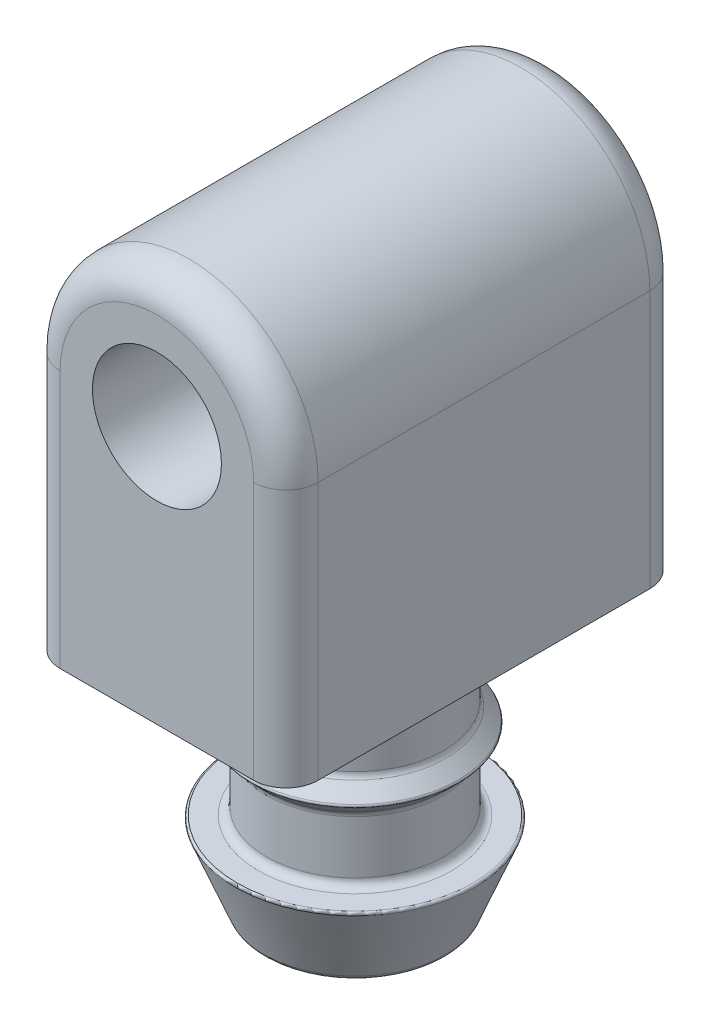
ISO-10303-21;
HEADER;
FILE_DESCRIPTION(('STEP AP214'),'2;1');
FILE_NAME('part.step','',(''),(''),'','','');
FILE_SCHEMA(('AUTOMOTIVE_DESIGN { 1 0 10303 214 1 1 1 1 }'));
ENDSEC;
DATA;
#1=APPLICATION_CONTEXT('core data for automotive mechanical design processes');
#2=APPLICATION_PROTOCOL_DEFINITION('international standard','automotive_design',2000,#1);
#3=PRODUCT_CONTEXT('',#1,'mechanical');
#4=PRODUCT('Part','Part','',(#3));
#5=PRODUCT_RELATED_PRODUCT_CATEGORY('part','',(#4));
#6=PRODUCT_DEFINITION_FORMATION('','',#4);
#7=PRODUCT_DEFINITION_CONTEXT('part definition',#1,'design');
#8=PRODUCT_DEFINITION('design','',#6,#7);
#9=PRODUCT_DEFINITION_SHAPE('','',#8);
#10=(LENGTH_UNIT() NAMED_UNIT(*) SI_UNIT(.MILLI.,.METRE.));
#11=(NAMED_UNIT(*) PLANE_ANGLE_UNIT() SI_UNIT($,.RADIAN.));
#12=(NAMED_UNIT(*) SI_UNIT($,.STERADIAN.) SOLID_ANGLE_UNIT());
#13=UNCERTAINTY_MEASURE_WITH_UNIT(LENGTH_MEASURE(1.E-05),#10,'distance_accuracy_value','');
#14=(GEOMETRIC_REPRESENTATION_CONTEXT(3) GLOBAL_UNCERTAINTY_ASSIGNED_CONTEXT((#13)) GLOBAL_UNIT_ASSIGNED_CONTEXT((#10,
#11,#12)) REPRESENTATION_CONTEXT('',''));
#15=CARTESIAN_POINT('',(0.,0.,0.));
#16=DIRECTION('',(0.,0.,1.));
#17=DIRECTION('',(1.,0.,0.));
#18=AXIS2_PLACEMENT_3D('',#15,#16,#17);
#19=CARTESIAN_POINT('',(0.,0.,9.75));
#20=DIRECTION('',(0.,0.,1.));
#21=DIRECTION('',(1.,0.,0.));
#22=AXIS2_PLACEMENT_3D('',#19,#20,#21);
#23=PLANE('',#22);
#24=CARTESIAN_POINT('',(0.,0.,9.75));
#25=DIRECTION('',(0.,0.,1.));
#26=DIRECTION('',(1.,0.,0.));
#27=AXIS2_PLACEMENT_3D('',#24,#25,#26);
#28=CIRCLE('',#27,4.7625);
#29=CARTESIAN_POINT('',(4.7625,0.,9.75));
#30=VERTEX_POINT('',#29);
#31=CARTESIAN_POINT('',(-4.7625,0.,9.75));
#32=VERTEX_POINT('',#31);
#33=EDGE_CURVE('E54',#30,#32,#28,.T.);
#34=ORIENTED_EDGE('',*,*,#33,.T.);
#35=DIRECTION('',(0.,-1.,0.));
#36=VECTOR('',#35,1.);
#37=CARTESIAN_POINT('',(-4.7625,-12.7,9.75));
#38=LINE('',#37,#36);
#39=CARTESIAN_POINT('',(-4.7625,-12.7,9.75));
#40=VERTEX_POINT('',#39);
#41=EDGE_CURVE('E150',#32,#40,#38,.T.);
#42=ORIENTED_EDGE('',*,*,#41,.T.);
#43=DIRECTION('',(1.,0.,0.));
#44=VECTOR('',#43,1.);
#45=CARTESIAN_POINT('',(-6.35,-12.7,9.75));
#46=LINE('',#45,#44);
#47=CARTESIAN_POINT('',(4.7625,-12.7,9.75));
#48=VERTEX_POINT('',#47);
#49=EDGE_CURVE('E109',#40,#48,#46,.T.);
#50=ORIENTED_EDGE('',*,*,#49,.T.);
#51=DIRECTION('',(0.,1.,0.));
#52=VECTOR('',#51,1.);
#53=CARTESIAN_POINT('',(4.7625,0.,9.75));
#54=LINE('',#53,#52);
#55=EDGE_CURVE('E59',#48,#30,#54,.T.);
#56=ORIENTED_EDGE('',*,*,#55,.T.);
#57=EDGE_LOOP('',(#34,#42,#50,#56));
#58=FACE_BOUND('',#57,.T.);
#59=CARTESIAN_POINT('',(0.,0.,9.75));
#60=DIRECTION('',(0.,0.,1.));
#61=DIRECTION('',(1.,0.,0.));
#62=AXIS2_PLACEMENT_3D('',#59,#60,#61);
#63=CIRCLE('',#62,3.175);
#64=CARTESIAN_POINT('',(3.175,0.,9.75));
#65=VERTEX_POINT('',#64);
#66=EDGE_CURVE('E615',#65,#65,#63,.T.);
#67=ORIENTED_EDGE('',*,*,#66,.F.);
#68=EDGE_LOOP('',(#67));
#69=FACE_BOUND('',#68,.T.);
#70=ADVANCED_FACE('F39',(#58,#69),#23,.T.);
#71=CARTESIAN_POINT('',(0.,0.,-9.75));
#72=DIRECTION('',(0.,0.,1.));
#73=DIRECTION('',(1.,0.,0.));
#74=AXIS2_PLACEMENT_3D('',#71,#72,#73);
#75=PLANE('',#74);
#76=DIRECTION('',(1.,0.,0.));
#77=VECTOR('',#76,1.);
#78=CARTESIAN_POINT('',(-6.35,-12.7,-9.75));
#79=LINE('',#78,#77);
#80=CARTESIAN_POINT('',(-4.7625,-12.7,-9.75));
#81=VERTEX_POINT('',#80);
#82=CARTESIAN_POINT('',(4.7625,-12.7,-9.75));
#83=VERTEX_POINT('',#82);
#84=EDGE_CURVE('E620',#81,#83,#79,.T.);
#85=ORIENTED_EDGE('',*,*,#84,.F.);
#86=DIRECTION('',(0.,-1.,0.));
#87=VECTOR('',#86,1.);
#88=CARTESIAN_POINT('',(-4.7625,0.,-9.75));
#89=LINE('',#88,#87);
#90=CARTESIAN_POINT('',(-4.7625,0.,-9.75));
#91=VERTEX_POINT('',#90);
#92=EDGE_CURVE('E142',#81,#91,#89,.F.);
#93=ORIENTED_EDGE('',*,*,#92,.T.);
#94=CARTESIAN_POINT('',(0.,0.,-9.75));
#95=DIRECTION('',(0.,0.,1.));
#96=DIRECTION('',(1.,0.,0.));
#97=AXIS2_PLACEMENT_3D('',#94,#95,#96);
#98=CIRCLE('',#97,4.7625);
#99=CARTESIAN_POINT('',(4.7625,0.,-9.75));
#100=VERTEX_POINT('',#99);
#101=EDGE_CURVE('E140',#91,#100,#98,.F.);
#102=ORIENTED_EDGE('',*,*,#101,.T.);
#103=DIRECTION('',(0.,1.,0.));
#104=VECTOR('',#103,1.);
#105=CARTESIAN_POINT('',(4.7625,0.,-9.75));
#106=LINE('',#105,#104);
#107=EDGE_CURVE('E138',#100,#83,#106,.F.);
#108=ORIENTED_EDGE('',*,*,#107,.T.);
#109=EDGE_LOOP('',(#85,#93,#102,#108));
#110=FACE_BOUND('',#109,.T.);
#111=CARTESIAN_POINT('',(0.,0.,-9.75));
#112=DIRECTION('',(0.,0.,1.));
#113=DIRECTION('',(1.,0.,0.));
#114=AXIS2_PLACEMENT_3D('',#111,#112,#113);
#115=CIRCLE('',#114,3.175);
#116=CARTESIAN_POINT('',(3.175,0.,-9.75));
#117=VERTEX_POINT('',#116);
#118=EDGE_CURVE('E170',#117,#117,#115,.T.);
#119=ORIENTED_EDGE('',*,*,#118,.T.);
#120=EDGE_LOOP('',(#119));
#121=FACE_BOUND('',#120,.T.);
#122=ADVANCED_FACE('F230',(#110,#121),#75,.F.);
#123=CARTESIAN_POINT('',(0.,0.,9.75));
#124=DIRECTION('',(0.,0.,-1.));
#125=DIRECTION('',(-1.,0.,0.));
#126=AXIS2_PLACEMENT_3D('',#123,#124,#125);
#127=CYLINDRICAL_SURFACE('',#126,6.35);
#128=DIRECTION('',(0.,0.,-1.));
#129=VECTOR('',#128,1.);
#130=CARTESIAN_POINT('',(6.35,0.,9.75));
#131=LINE('',#130,#129);
#132=CARTESIAN_POINT('',(6.35,0.,8.1625));
#133=VERTEX_POINT('',#132);
#134=CARTESIAN_POINT('',(6.35,0.,-8.1625));
#135=VERTEX_POINT('',#134);
#136=EDGE_CURVE('E624',#133,#135,#131,.T.);
#137=ORIENTED_EDGE('',*,*,#136,.T.);
#138=CARTESIAN_POINT('',(0.,0.,-8.1625));
#139=DIRECTION('',(0.,0.,1.));
#140=DIRECTION('',(1.,0.,0.));
#141=AXIS2_PLACEMENT_3D('',#138,#139,#140);
#142=CIRCLE('',#141,6.35);
#143=CARTESIAN_POINT('',(-6.35,0.,-8.1625));
#144=VERTEX_POINT('',#143);
#145=EDGE_CURVE('E146',#135,#144,#142,.T.);
#146=ORIENTED_EDGE('',*,*,#145,.T.);
#147=DIRECTION('',(0.,0.,-1.));
#148=VECTOR('',#147,1.);
#149=CARTESIAN_POINT('',(-6.35,0.,9.75));
#150=LINE('',#149,#148);
#151=CARTESIAN_POINT('',(-6.35,0.,8.1625));
#152=VERTEX_POINT('',#151);
#153=EDGE_CURVE('E124',#152,#144,#150,.T.);
#154=ORIENTED_EDGE('',*,*,#153,.F.);
#155=CARTESIAN_POINT('',(0.,0.,8.1625));
#156=DIRECTION('',(0.,0.,1.));
#157=DIRECTION('',(1.,0.,0.));
#158=AXIS2_PLACEMENT_3D('',#155,#156,#157);
#159=CIRCLE('',#158,6.35);
#160=EDGE_CURVE('E144',#152,#133,#159,.F.);
#161=ORIENTED_EDGE('',*,*,#160,.T.);
#162=EDGE_LOOP('',(#137,#146,#154,#161));
#163=FACE_BOUND('',#162,.T.);
#164=ADVANCED_FACE('F235',(#163),#127,.T.);
#165=CARTESIAN_POINT('',(-6.35,0.,9.75));
#166=DIRECTION('',(1.,0.,0.));
#167=DIRECTION('',(0.,1.,0.));
#168=AXIS2_PLACEMENT_3D('',#165,#166,#167);
#169=PLANE('',#168);
#170=ORIENTED_EDGE('',*,*,#153,.T.);
#171=DIRECTION('',(0.,-1.,0.));
#172=VECTOR('',#171,1.);
#173=CARTESIAN_POINT('',(-6.35,0.,-8.1625));
#174=LINE('',#173,#172);
#175=CARTESIAN_POINT('',(-6.35,-12.7,-8.1625));
#176=VERTEX_POINT('',#175);
#177=EDGE_CURVE('E123',#144,#176,#174,.T.);
#178=ORIENTED_EDGE('',*,*,#177,.T.);
#179=DIRECTION('',(0.,0.,-1.));
#180=VECTOR('',#179,1.);
#181=CARTESIAN_POINT('',(-6.35,-12.7,9.75));
#182=LINE('',#181,#180);
#183=CARTESIAN_POINT('',(-6.35,-12.7,8.1625));
#184=VERTEX_POINT('',#183);
#185=EDGE_CURVE('E108',#184,#176,#182,.T.);
#186=ORIENTED_EDGE('',*,*,#185,.F.);
#187=DIRECTION('',(0.,-1.,0.));
#188=VECTOR('',#187,1.);
#189=CARTESIAN_POINT('',(-6.35,0.,8.1625));
#190=LINE('',#189,#188);
#191=EDGE_CURVE('E120',#184,#152,#190,.F.);
#192=ORIENTED_EDGE('',*,*,#191,.T.);
#193=EDGE_LOOP('',(#170,#178,#186,#192));
#194=FACE_BOUND('',#193,.T.);
#195=ADVANCED_FACE('F119',(#194),#169,.F.);
#196=CARTESIAN_POINT('',(-6.35,-12.7,9.75));
#197=DIRECTION('',(0.,1.,0.));
#198=DIRECTION('',(0.,0.,1.));
#199=AXIS2_PLACEMENT_3D('',#196,#197,#198);
#200=PLANE('',#199);
#201=CARTESIAN_POINT('',(0.,-12.7,0.));
#202=DIRECTION('',(0.,1.,0.));
#203=DIRECTION('',(0.,0.,1.));
#204=AXIS2_PLACEMENT_3D('',#201,#202,#203);
#205=CIRCLE('',#204,4.7625);
#206=CARTESIAN_POINT('',(0.,-12.7,4.7625));
#207=VERTEX_POINT('',#206);
#208=EDGE_CURVE('E191',#207,#207,#205,.T.);
#209=ORIENTED_EDGE('',*,*,#208,.T.);
#210=EDGE_LOOP('',(#209));
#211=FACE_BOUND('',#210,.T.);
#212=ORIENTED_EDGE('',*,*,#185,.T.);
#213=CARTESIAN_POINT('',(-4.7625,-12.7,-8.1625));
#214=DIRECTION('',(0.,1.,0.));
#215=DIRECTION('',(0.,0.,1.));
#216=AXIS2_PLACEMENT_3D('',#213,#214,#215);
#217=CIRCLE('',#216,1.5875);
#218=EDGE_CURVE('E113',#176,#81,#217,.F.);
#219=ORIENTED_EDGE('',*,*,#218,.T.);
#220=ORIENTED_EDGE('',*,*,#84,.T.);
#221=CARTESIAN_POINT('',(4.7625,-12.7,-8.1625));
#222=DIRECTION('',(0.,1.,0.));
#223=DIRECTION('',(0.,0.,1.));
#224=AXIS2_PLACEMENT_3D('',#221,#222,#223);
#225=CIRCLE('',#224,1.5875);
#226=CARTESIAN_POINT('',(6.35,-12.7,-8.1625));
#227=VERTEX_POINT('',#226);
#228=EDGE_CURVE('E114',#83,#227,#225,.F.);
#229=ORIENTED_EDGE('',*,*,#228,.T.);
#230=DIRECTION('',(0.,0.,-1.));
#231=VECTOR('',#230,1.);
#232=CARTESIAN_POINT('',(6.35,-12.7,9.75));
#233=LINE('',#232,#231);
#234=CARTESIAN_POINT('',(6.35,-12.7,8.1625));
#235=VERTEX_POINT('',#234);
#236=EDGE_CURVE('E125',#235,#227,#233,.T.);
#237=ORIENTED_EDGE('',*,*,#236,.F.);
#238=CARTESIAN_POINT('',(4.7625,-12.7,8.1625));
#239=DIRECTION('',(0.,1.,0.));
#240=DIRECTION('',(0.,0.,1.));
#241=AXIS2_PLACEMENT_3D('',#238,#239,#240);
#242=CIRCLE('',#241,1.5875);
#243=EDGE_CURVE('E131',#235,#48,#242,.F.);
#244=ORIENTED_EDGE('',*,*,#243,.T.);
#245=ORIENTED_EDGE('',*,*,#49,.F.);
#246=CARTESIAN_POINT('',(-4.7625,-12.7,8.1625));
#247=DIRECTION('',(0.,1.,0.));
#248=DIRECTION('',(0.,0.,1.));
#249=AXIS2_PLACEMENT_3D('',#246,#247,#248);
#250=CIRCLE('',#249,1.5875);
#251=EDGE_CURVE('E105',#40,#184,#250,.F.);
#252=ORIENTED_EDGE('',*,*,#251,.T.);
#253=EDGE_LOOP('',(#212,#219,#220,#229,#237,#244,#245,#252));
#254=FACE_BOUND('',#253,.T.);
#255=ADVANCED_FACE('F107',(#211,#254),#200,.F.);
#256=CARTESIAN_POINT('',(6.35,-12.7,9.75));
#257=DIRECTION('',(-1.,0.,0.));
#258=DIRECTION('',(0.,-1.,0.));
#259=AXIS2_PLACEMENT_3D('',#256,#257,#258);
#260=PLANE('',#259);
#261=ORIENTED_EDGE('',*,*,#236,.T.);
#262=DIRECTION('',(0.,1.,0.));
#263=VECTOR('',#262,1.);
#264=CARTESIAN_POINT('',(6.35,-12.7,-8.1625));
#265=LINE('',#264,#263);
#266=EDGE_CURVE('E160',#227,#135,#265,.T.);
#267=ORIENTED_EDGE('',*,*,#266,.T.);
#268=ORIENTED_EDGE('',*,*,#136,.F.);
#269=DIRECTION('',(0.,1.,0.));
#270=VECTOR('',#269,1.);
#271=CARTESIAN_POINT('',(6.35,-12.7,8.1625));
#272=LINE('',#271,#270);
#273=EDGE_CURVE('E158',#133,#235,#272,.F.);
#274=ORIENTED_EDGE('',*,*,#273,.T.);
#275=EDGE_LOOP('',(#261,#267,#268,#274));
#276=FACE_BOUND('',#275,.T.);
#277=ADVANCED_FACE('F243',(#276),#260,.F.);
#278=CARTESIAN_POINT('',(0.,0.,9.75));
#279=DIRECTION('',(0.,0.,-1.));
#280=DIRECTION('',(-1.,0.,0.));
#281=AXIS2_PLACEMENT_3D('',#278,#279,#280);
#282=CYLINDRICAL_SURFACE('',#281,3.175);
#283=ORIENTED_EDGE('',*,*,#66,.T.);
#284=EDGE_LOOP('',(#283));
#285=FACE_BOUND('',#284,.T.);
#286=ORIENTED_EDGE('',*,*,#118,.F.);
#287=EDGE_LOOP('',(#286));
#288=FACE_BOUND('',#287,.T.);
#289=ADVANCED_FACE('F240',(#285,#288),#282,.F.);
#290=CARTESIAN_POINT('',(0.,9.54404991046198,0.));
#291=DIRECTION('',(0.,1.,0.));
#292=DIRECTION('',(-1.,0.,0.));
#293=AXIS2_PLACEMENT_3D('',#290,#291,#292);
#294=CYLINDRICAL_SURFACE('',#293,4.365625);
#295=CARTESIAN_POINT('',(0.,-16.5043589924332,0.));
#296=DIRECTION('',(0.,1.,0.));
#297=DIRECTION('',(-1.,0.,0.));
#298=AXIS2_PLACEMENT_3D('',#295,#296,#297);
#299=CIRCLE('',#298,4.365625);
#300=CARTESIAN_POINT('',(-4.365625,-16.5043589924332,0.));
#301=VERTEX_POINT('',#300);
#302=EDGE_CURVE('E185',#301,#301,#299,.T.);
#303=ORIENTED_EDGE('',*,*,#302,.T.);
#304=EDGE_LOOP('',(#303));
#305=FACE_BOUND('',#304,.T.);
#306=CARTESIAN_POINT('',(0.,-13.096875,0.));
#307=DIRECTION('',(0.,1.,0.));
#308=DIRECTION('',(0.,0.,1.));
#309=AXIS2_PLACEMENT_3D('',#306,#307,#308);
#310=CIRCLE('',#309,4.365625);
#311=CARTESIAN_POINT('',(0.,-13.096875,4.365625));
#312=VERTEX_POINT('',#311);
#313=EDGE_CURVE('E182',#312,#312,#310,.F.);
#314=ORIENTED_EDGE('',*,*,#313,.T.);
#315=EDGE_LOOP('',(#314));
#316=FACE_BOUND('',#315,.T.);
#317=ADVANCED_FACE('F314',(#305,#316),#294,.T.);
#318=CARTESIAN_POINT('',(0.,-17.4625,0.));
#319=DIRECTION('',(0.,-1.,0.));
#320=DIRECTION('',(1.,0.,0.));
#321=AXIS2_PLACEMENT_3D('',#318,#319,#320);
#322=CONICAL_SURFACE('',#321,5.159375,0.785398163397449);
#323=CARTESIAN_POINT('',(0.,-17.3923417490541,0.));
#324=DIRECTION('',(0.,1.,0.));
#325=DIRECTION('',(-1.,0.,0.));
#326=AXIS2_PLACEMENT_3D('',#323,#324,#325);
#327=CIRCLE('',#326,5.08921674905414);
#328=CARTESIAN_POINT('',(-5.08921674905414,-17.3923417490541,0.));
#329=VERTEX_POINT('',#328);
#330=EDGE_CURVE('E203',#329,#329,#327,.T.);
#331=ORIENTED_EDGE('',*,*,#330,.T.);
#332=EDGE_LOOP('',(#331));
#333=FACE_BOUND('',#332,.T.);
#334=CARTESIAN_POINT('',(0.,-16.7849919962166,0.));
#335=DIRECTION('',(0.,-1.,0.));
#336=DIRECTION('',(1.,0.,0.));
#337=AXIS2_PLACEMENT_3D('',#334,#335,#336);
#338=CIRCLE('',#337,4.48186699621659);
#339=CARTESIAN_POINT('',(4.48186699621659,-16.7849919962166,0.));
#340=VERTEX_POINT('',#339);
#341=EDGE_CURVE('E188',#340,#340,#338,.T.);
#342=ORIENTED_EDGE('',*,*,#341,.T.);
#343=EDGE_LOOP('',(#342));
#344=FACE_BOUND('',#343,.T.);
#345=ADVANCED_FACE('F310',(#333,#344),#322,.T.);
#346=CARTESIAN_POINT('',(0.,-18.25625,0.));
#347=DIRECTION('',(0.,1.,0.));
#348=DIRECTION('',(-1.,0.,0.));
#349=AXIS2_PLACEMENT_3D('',#346,#347,#348);
#350=CONICAL_SURFACE('',#349,4.365625,0.785398163397449);
#351=CARTESIAN_POINT('',(0.,-17.5326582509459,0.));
#352=DIRECTION('',(0.,-1.,0.));
#353=DIRECTION('',(1.,0.,0.));
#354=AXIS2_PLACEMENT_3D('',#351,#352,#353);
#355=CIRCLE('',#354,5.08921674905414);
#356=CARTESIAN_POINT('',(5.08921674905415,-17.5326582509459,0.));
#357=VERTEX_POINT('',#356);
#358=EDGE_CURVE('E206',#357,#357,#355,.T.);
#359=ORIENTED_EDGE('',*,*,#358,.T.);
#360=EDGE_LOOP('',(#359));
#361=FACE_BOUND('',#360,.T.);
#362=CARTESIAN_POINT('',(0.,-18.1400080037834,0.));
#363=DIRECTION('',(0.,1.,0.));
#364=DIRECTION('',(-1.,0.,0.));
#365=AXIS2_PLACEMENT_3D('',#362,#363,#364);
#366=CIRCLE('',#365,4.48186699621659);
#367=CARTESIAN_POINT('',(-4.48186699621658,-18.1400080037834,0.));
#368=VERTEX_POINT('',#367);
#369=EDGE_CURVE('E162',#368,#368,#366,.T.);
#370=ORIENTED_EDGE('',*,*,#369,.T.);
#371=EDGE_LOOP('',(#370));
#372=FACE_BOUND('',#371,.T.);
#373=ADVANCED_FACE('F313',(#361,#372),#350,.T.);
#374=CARTESIAN_POINT('',(0.,9.54404991046198,0.));
#375=DIRECTION('',(0.,1.,0.));
#376=DIRECTION('',(-1.,0.,0.));
#377=AXIS2_PLACEMENT_3D('',#374,#375,#376);
#378=CYLINDRICAL_SURFACE('',#377,4.365625);
#379=CARTESIAN_POINT('',(0.,-18.4206410075668,0.));
#380=DIRECTION('',(0.,1.,0.));
#381=DIRECTION('',(-1.,0.,0.));
#382=AXIS2_PLACEMENT_3D('',#379,#380,#381);
#383=CIRCLE('',#382,4.365625);
#384=CARTESIAN_POINT('',(-4.36562499999999,-18.4206410075668,0.));
#385=VERTEX_POINT('',#384);
#386=EDGE_CURVE('E179',#385,#385,#383,.F.);
#387=ORIENTED_EDGE('',*,*,#386,.T.);
#388=EDGE_LOOP('',(#387));
#389=FACE_BOUND('',#388,.T.);
#390=CARTESIAN_POINT('',(0.,-21.034375,0.));
#391=DIRECTION('',(0.,-1.,0.));
#392=DIRECTION('',(1.,0.,0.));
#393=AXIS2_PLACEMENT_3D('',#390,#391,#392);
#394=CIRCLE('',#393,4.365625);
#395=CARTESIAN_POINT('',(4.365625,-21.034375,0.));
#396=VERTEX_POINT('',#395);
#397=EDGE_CURVE('E176',#396,#396,#394,.F.);
#398=ORIENTED_EDGE('',*,*,#397,.T.);
#399=EDGE_LOOP('',(#398));
#400=FACE_BOUND('',#399,.T.);
#401=ADVANCED_FACE('F332',(#389,#400),#378,.T.);
#402=CARTESIAN_POINT('',(5.953125,-21.43125,0.));
#403=DIRECTION('',(0.,-1.,0.));
#404=DIRECTION('',(1.,0.,0.));
#405=AXIS2_PLACEMENT_3D('',#402,#403,#404);
#406=PLANE('',#405);
#407=CARTESIAN_POINT('',(0.,-21.43125,0.));
#408=DIRECTION('',(0.,-1.,0.));
#409=DIRECTION('',(1.,0.,0.));
#410=AXIS2_PLACEMENT_3D('',#407,#408,#409);
#411=CIRCLE('',#410,5.80657563585842);
#412=CARTESIAN_POINT('',(5.80657563585843,-21.43125,0.));
#413=VERTEX_POINT('',#412);
#414=EDGE_CURVE('E209',#413,#413,#411,.F.);
#415=ORIENTED_EDGE('',*,*,#414,.T.);
#416=EDGE_LOOP('',(#415));
#417=FACE_BOUND('',#416,.T.);
#418=CARTESIAN_POINT('',(0.,-21.43125,0.));
#419=DIRECTION('',(0.,-1.,0.));
#420=DIRECTION('',(1.,0.,0.));
#421=AXIS2_PLACEMENT_3D('',#418,#419,#420);
#422=CIRCLE('',#421,4.7625);
#423=CARTESIAN_POINT('',(4.7625,-21.43125,0.));
#424=VERTEX_POINT('',#423);
#425=EDGE_CURVE('E200',#424,#424,#422,.T.);
#426=ORIENTED_EDGE('',*,*,#425,.T.);
#427=EDGE_LOOP('',(#426));
#428=FACE_BOUND('',#427,.T.);
#429=ADVANCED_FACE('F336',(#417,#428),#406,.F.);
#430=CARTESIAN_POINT('',(0.,-25.4,0.));
#431=DIRECTION('',(0.,1.,0.));
#432=DIRECTION('',(-1.,0.,0.));
#433=AXIS2_PLACEMENT_3D('',#430,#431,#432);
#434=CONICAL_SURFACE('',#433,4.365625,0.380506377112365);
#435=CARTESIAN_POINT('',(0.,-21.5673176686695,0.));
#436=DIRECTION('',(0.,-1.,0.));
#437=DIRECTION('',(1.,0.,0.));
#438=AXIS2_PLACEMENT_3D('',#435,#436,#437);
#439=CIRCLE('',#438,5.8986979325322);
#440=CARTESIAN_POINT('',(5.8986979325322,-21.5673176686695,0.));
#441=VERTEX_POINT('',#440);
#442=EDGE_CURVE('E212',#441,#441,#439,.T.);
#443=ORIENTED_EDGE('',*,*,#442,.T.);
#444=EDGE_LOOP('',(#443));
#445=FACE_BOUND('',#444,.T.);
#446=CARTESIAN_POINT('',(0.,-25.150520674678,0.));
#447=DIRECTION('',(0.,-1.,0.));
#448=DIRECTION('',(1.,0.,0.));
#449=AXIS2_PLACEMENT_3D('',#446,#447,#448);
#450=CIRCLE('',#449,4.46541673012878);
#451=CARTESIAN_POINT('',(4.46541673012879,-25.150520674678,0.));
#452=VERTEX_POINT('',#451);
#453=EDGE_CURVE('E194',#452,#452,#450,.F.);
#454=ORIENTED_EDGE('',*,*,#453,.T.);
#455=EDGE_LOOP('',(#454));
#456=FACE_BOUND('',#455,.T.);
#457=ADVANCED_FACE('F340',(#445,#456),#434,.T.);
#458=CARTESIAN_POINT('',(0.,-25.4,0.));
#459=DIRECTION('',(0.,1.,0.));
#460=DIRECTION('',(-1.,0.,0.));
#461=AXIS2_PLACEMENT_3D('',#458,#459,#460);
#462=PLANE('',#461);
#463=CARTESIAN_POINT('',(0.,-25.4,0.));
#464=DIRECTION('',(0.,1.,0.));
#465=DIRECTION('',(-1.,0.,0.));
#466=AXIS2_PLACEMENT_3D('',#463,#464,#465);
#467=CIRCLE('',#466,2.63525000000001);
#468=CARTESIAN_POINT('',(-2.63525000000001,-25.4,0.));
#469=VERTEX_POINT('',#468);
#470=EDGE_CURVE('E11',#469,#469,#467,.T.);
#471=ORIENTED_EDGE('',*,*,#470,.T.);
#472=EDGE_LOOP('',(#471));
#473=FACE_BOUND('',#472,.T.);
#474=CARTESIAN_POINT('',(0.,-25.4,0.));
#475=DIRECTION('',(0.,1.,0.));
#476=DIRECTION('',(-1.,0.,0.));
#477=AXIS2_PLACEMENT_3D('',#474,#475,#476);
#478=CIRCLE('',#477,4.0969275434337);
#479=CARTESIAN_POINT('',(-4.09692754343369,-25.4,0.));
#480=VERTEX_POINT('',#479);
#481=EDGE_CURVE('E197',#480,#480,#478,.F.);
#482=ORIENTED_EDGE('',*,*,#481,.T.);
#483=EDGE_LOOP('',(#482));
#484=FACE_BOUND('',#483,.T.);
#485=ADVANCED_FACE('F344',(#473,#484),#462,.F.);
#486=CARTESIAN_POINT('',(0.,-4.7625,0.));
#487=DIRECTION('',(0.,-1.,0.));
#488=DIRECTION('',(1.,0.,0.));
#489=AXIS2_PLACEMENT_3D('',#486,#487,#488);
#490=CYLINDRICAL_SURFACE('',#489,2.38125);
#491=CARTESIAN_POINT('',(0.,-25.146,0.));
#492=DIRECTION('',(0.,1.,0.));
#493=DIRECTION('',(-1.,0.,0.));
#494=AXIS2_PLACEMENT_3D('',#491,#492,#493);
#495=CIRCLE('',#494,2.38125);
#496=CARTESIAN_POINT('',(-2.38125,-25.146,0.));
#497=VERTEX_POINT('',#496);
#498=EDGE_CURVE('E47',#497,#497,#495,.F.);
#499=ORIENTED_EDGE('',*,*,#498,.T.);
#500=EDGE_LOOP('',(#499));
#501=FACE_BOUND('',#500,.T.);
#502=CARTESIAN_POINT('',(0.,-6.35,0.));
#503=DIRECTION('',(0.,-1.,0.));
#504=DIRECTION('',(1.,0.,0.));
#505=AXIS2_PLACEMENT_3D('',#502,#503,#504);
#506=CIRCLE('',#505,2.38125);
#507=CARTESIAN_POINT('',(2.38125,-6.35,0.));
#508=VERTEX_POINT('',#507);
#509=EDGE_CURVE('E155',#508,#508,#506,.F.);
#510=ORIENTED_EDGE('',*,*,#509,.T.);
#511=EDGE_LOOP('',(#510));
#512=FACE_BOUND('',#511,.T.);
#513=ADVANCED_FACE('F217',(#501,#512),#490,.F.);
#514=CARTESIAN_POINT('',(0.,-4.7625,0.));
#515=DIRECTION('',(0.,-1.,0.));
#516=DIRECTION('',(1.,0.,0.));
#517=AXIS2_PLACEMENT_3D('',#514,#515,#516);
#518=PLANE('',#517);
#519=CARTESIAN_POINT('',(0.,-4.7625,0.));
#520=DIRECTION('',(0.,-1.,0.));
#521=DIRECTION('',(1.,0.,0.));
#522=AXIS2_PLACEMENT_3D('',#519,#520,#521);
#523=CIRCLE('',#522,0.79375);
#524=CARTESIAN_POINT('',(0.793750000000001,-4.7625,0.));
#525=VERTEX_POINT('',#524);
#526=EDGE_CURVE('E152',#525,#525,#523,.T.);
#527=ORIENTED_EDGE('',*,*,#526,.T.);
#528=EDGE_LOOP('',(#527));
#529=FACE_BOUND('',#528,.T.);
#530=ADVANCED_FACE('F267',(#529),#518,.T.);
#531=CARTESIAN_POINT('',(4.7625,-12.7,-8.1625));
#532=DIRECTION('',(0.,1.,0.));
#533=DIRECTION('',(-1.,0.,0.));
#534=AXIS2_PLACEMENT_3D('',#531,#532,#533);
#535=CYLINDRICAL_SURFACE('',#534,1.5875);
#536=ORIENTED_EDGE('',*,*,#228,.F.);
#537=ORIENTED_EDGE('',*,*,#107,.F.);
#538=CARTESIAN_POINT('',(4.7625,0.,-8.1625));
#539=DIRECTION('',(0.,1.,0.));
#540=DIRECTION('',(-1.,0.,0.));
#541=AXIS2_PLACEMENT_3D('',#538,#539,#540);
#542=CIRCLE('',#541,1.5875);
#543=EDGE_CURVE('E166',#135,#100,#542,.T.);
#544=ORIENTED_EDGE('',*,*,#543,.F.);
#545=ORIENTED_EDGE('',*,*,#266,.F.);
#546=EDGE_LOOP('',(#536,#537,#544,#545));
#547=FACE_BOUND('',#546,.T.);
#548=ADVANCED_FACE('F263',(#547),#535,.T.);
#549=CARTESIAN_POINT('',(0.,0.,-8.1625));
#550=DIRECTION('',(0.,0.,1.));
#551=DIRECTION('',(1.,0.,0.));
#552=AXIS2_PLACEMENT_3D('',#549,#550,#551);
#553=TOROIDAL_SURFACE('',#552,4.7625,1.5875);
#554=ORIENTED_EDGE('',*,*,#543,.T.);
#555=ORIENTED_EDGE('',*,*,#101,.F.);
#556=CARTESIAN_POINT('',(-4.7625,0.,-8.1625));
#557=DIRECTION('',(0.,-1.,0.));
#558=DIRECTION('',(0.,0.,-1.));
#559=AXIS2_PLACEMENT_3D('',#556,#557,#558);
#560=CIRCLE('',#559,1.5875);
#561=EDGE_CURVE('E163',#144,#91,#560,.T.);
#562=ORIENTED_EDGE('',*,*,#561,.F.);
#563=ORIENTED_EDGE('',*,*,#145,.F.);
#564=EDGE_LOOP('',(#554,#555,#562,#563));
#565=FACE_BOUND('',#564,.T.);
#566=ADVANCED_FACE('F259',(#565),#553,.T.);
#567=CARTESIAN_POINT('',(-4.7625,0.,-8.1625));
#568=DIRECTION('',(0.,-1.,0.));
#569=DIRECTION('',(1.,0.,0.));
#570=AXIS2_PLACEMENT_3D('',#567,#568,#569);
#571=CYLINDRICAL_SURFACE('',#570,1.5875);
#572=ORIENTED_EDGE('',*,*,#561,.T.);
#573=ORIENTED_EDGE('',*,*,#92,.F.);
#574=ORIENTED_EDGE('',*,*,#218,.F.);
#575=ORIENTED_EDGE('',*,*,#177,.F.);
#576=EDGE_LOOP('',(#572,#573,#574,#575));
#577=FACE_BOUND('',#576,.T.);
#578=ADVANCED_FACE('F255',(#577),#571,.T.);
#579=CARTESIAN_POINT('',(4.7625,0.,8.1625));
#580=DIRECTION('',(0.,-1.,0.));
#581=DIRECTION('',(1.,0.,0.));
#582=AXIS2_PLACEMENT_3D('',#579,#580,#581);
#583=CYLINDRICAL_SURFACE('',#582,1.5875);
#584=ORIENTED_EDGE('',*,*,#243,.F.);
#585=ORIENTED_EDGE('',*,*,#273,.F.);
#586=CARTESIAN_POINT('',(4.7625,0.,8.1625));
#587=DIRECTION('',(0.,1.,0.));
#588=DIRECTION('',(0.,0.,1.));
#589=AXIS2_PLACEMENT_3D('',#586,#587,#588);
#590=CIRCLE('',#589,1.5875);
#591=EDGE_CURVE('E167',#30,#133,#590,.T.);
#592=ORIENTED_EDGE('',*,*,#591,.F.);
#593=ORIENTED_EDGE('',*,*,#55,.F.);
#594=EDGE_LOOP('',(#584,#585,#592,#593));
#595=FACE_BOUND('',#594,.T.);
#596=ADVANCED_FACE('F258',(#595),#583,.T.);
#597=CARTESIAN_POINT('',(0.,0.,8.1625));
#598=DIRECTION('',(0.,0.,1.));
#599=DIRECTION('',(1.,0.,0.));
#600=AXIS2_PLACEMENT_3D('',#597,#598,#599);
#601=TOROIDAL_SURFACE('',#600,4.7625,1.5875);
#602=ORIENTED_EDGE('',*,*,#591,.T.);
#603=ORIENTED_EDGE('',*,*,#160,.F.);
#604=CARTESIAN_POINT('',(-4.7625,0.,8.1625));
#605=DIRECTION('',(0.,-1.,0.));
#606=DIRECTION('',(1.,0.,0.));
#607=AXIS2_PLACEMENT_3D('',#604,#605,#606);
#608=CIRCLE('',#607,1.5875);
#609=EDGE_CURVE('E129',#32,#152,#608,.T.);
#610=ORIENTED_EDGE('',*,*,#609,.F.);
#611=ORIENTED_EDGE('',*,*,#33,.F.);
#612=EDGE_LOOP('',(#602,#603,#610,#611));
#613=FACE_BOUND('',#612,.T.);
#614=ADVANCED_FACE('F272',(#613),#601,.T.);
#615=CARTESIAN_POINT('',(-4.7625,0.,8.1625));
#616=DIRECTION('',(0.,1.,0.));
#617=DIRECTION('',(-1.,0.,0.));
#618=AXIS2_PLACEMENT_3D('',#615,#616,#617);
#619=CYLINDRICAL_SURFACE('',#618,1.5875);
#620=ORIENTED_EDGE('',*,*,#609,.T.);
#621=ORIENTED_EDGE('',*,*,#191,.F.);
#622=ORIENTED_EDGE('',*,*,#251,.F.);
#623=ORIENTED_EDGE('',*,*,#41,.F.);
#624=EDGE_LOOP('',(#620,#621,#622,#623));
#625=FACE_BOUND('',#624,.T.);
#626=ADVANCED_FACE('F128',(#625),#619,.T.);
#627=CARTESIAN_POINT('',(0.,-6.35,0.));
#628=DIRECTION('',(0.,-1.,0.));
#629=DIRECTION('',(1.,0.,0.));
#630=AXIS2_PLACEMENT_3D('',#627,#628,#629);
#631=DEGENERATE_TOROIDAL_SURFACE('',#630,0.79375,1.5875,.T.);
#632=ORIENTED_EDGE('',*,*,#509,.F.);
#633=EDGE_LOOP('',(#632));
#634=FACE_BOUND('',#633,.T.);
#635=ORIENTED_EDGE('',*,*,#526,.F.);
#636=EDGE_LOOP('',(#635));
#637=FACE_BOUND('',#636,.T.);
#638=ADVANCED_FACE('F271',(#634,#637),#631,.F.);
#639=CARTESIAN_POINT('',(0.,-18.4206410075668,0.));
#640=DIRECTION('',(0.,1.,0.));
#641=DIRECTION('',(-1.,0.,0.));
#642=AXIS2_PLACEMENT_3D('',#639,#640,#641);
#643=TOROIDAL_SURFACE('',#642,4.7625,0.396875);
#644=ORIENTED_EDGE('',*,*,#386,.F.);
#645=EDGE_LOOP('',(#644));
#646=FACE_BOUND('',#645,.T.);
#647=ORIENTED_EDGE('',*,*,#369,.F.);
#648=EDGE_LOOP('',(#647));
#649=FACE_BOUND('',#648,.T.);
#650=ADVANCED_FACE('F281',(#646,#649),#643,.F.);
#651=CARTESIAN_POINT('',(0.,-16.5043589924332,0.));
#652=DIRECTION('',(0.,1.,0.));
#653=DIRECTION('',(-1.,0.,0.));
#654=AXIS2_PLACEMENT_3D('',#651,#652,#653);
#655=TOROIDAL_SURFACE('',#654,4.7625,0.396875);
#656=ORIENTED_EDGE('',*,*,#341,.F.);
#657=EDGE_LOOP('',(#656));
#658=FACE_BOUND('',#657,.T.);
#659=ORIENTED_EDGE('',*,*,#302,.F.);
#660=EDGE_LOOP('',(#659));
#661=FACE_BOUND('',#660,.T.);
#662=ADVANCED_FACE('F285',(#658,#661),#655,.F.);
#663=CARTESIAN_POINT('',(0.,-13.096875,0.));
#664=DIRECTION('',(0.,1.,0.));
#665=DIRECTION('',(0.,0.,1.));
#666=AXIS2_PLACEMENT_3D('',#663,#664,#665);
#667=TOROIDAL_SURFACE('',#666,4.7625,0.396875);
#668=ORIENTED_EDGE('',*,*,#313,.F.);
#669=EDGE_LOOP('',(#668));
#670=FACE_BOUND('',#669,.T.);
#671=ORIENTED_EDGE('',*,*,#208,.F.);
#672=EDGE_LOOP('',(#671));
#673=FACE_BOUND('',#672,.T.);
#674=ADVANCED_FACE('F289',(#670,#673),#667,.F.);
#675=CARTESIAN_POINT('',(0.,-25.003125,0.));
#676=DIRECTION('',(0.,1.,0.));
#677=DIRECTION('',(-1.,0.,0.));
#678=AXIS2_PLACEMENT_3D('',#675,#676,#677);
#679=TOROIDAL_SURFACE('',#678,4.0969275434337,0.396875);
#680=ORIENTED_EDGE('',*,*,#481,.F.);
#681=EDGE_LOOP('',(#680));
#682=FACE_BOUND('',#681,.T.);
#683=ORIENTED_EDGE('',*,*,#453,.F.);
#684=EDGE_LOOP('',(#683));
#685=FACE_BOUND('',#684,.T.);
#686=ADVANCED_FACE('F293',(#682,#685),#679,.T.);
#687=CARTESIAN_POINT('',(0.,-21.034375,0.));
#688=DIRECTION('',(0.,-1.,0.));
#689=DIRECTION('',(1.,0.,0.));
#690=AXIS2_PLACEMENT_3D('',#687,#688,#689);
#691=TOROIDAL_SURFACE('',#690,4.7625,0.396875);
#692=ORIENTED_EDGE('',*,*,#425,.F.);
#693=EDGE_LOOP('',(#692));
#694=FACE_BOUND('',#693,.T.);
#695=ORIENTED_EDGE('',*,*,#397,.F.);
#696=EDGE_LOOP('',(#695));
#697=FACE_BOUND('',#696,.T.);
#698=ADVANCED_FACE('F297',(#694,#697),#691,.F.);
#699=CARTESIAN_POINT('',(0.,-17.4625,0.));
#700=DIRECTION('',(0.,-1.,0.));
#701=DIRECTION('',(1.,0.,0.));
#702=AXIS2_PLACEMENT_3D('',#699,#700,#701);
#703=TOROIDAL_SURFACE('',#702,5.01905849810829,0.09921875);
#704=ORIENTED_EDGE('',*,*,#358,.F.);
#705=EDGE_LOOP('',(#704));
#706=FACE_BOUND('',#705,.T.);
#707=ORIENTED_EDGE('',*,*,#330,.F.);
#708=EDGE_LOOP('',(#707));
#709=FACE_BOUND('',#708,.T.);
#710=ADVANCED_FACE('F226',(#706,#709),#703,.T.);
#711=CARTESIAN_POINT('',(0.,-21.53046875,0.));
#712=DIRECTION('',(0.,-1.,0.));
#713=DIRECTION('',(1.,0.,0.));
#714=AXIS2_PLACEMENT_3D('',#711,#712,#713);
#715=TOROIDAL_SURFACE('',#714,5.80657563585842,0.09921875);
#716=ORIENTED_EDGE('',*,*,#442,.F.);
#717=EDGE_LOOP('',(#716));
#718=FACE_BOUND('',#717,.T.);
#719=ORIENTED_EDGE('',*,*,#414,.F.);
#720=EDGE_LOOP('',(#719));
#721=FACE_BOUND('',#720,.T.);
#722=ADVANCED_FACE('F221',(#718,#721),#715,.T.);
#723=CARTESIAN_POINT('',(0.,-25.146,0.));
#724=DIRECTION('',(0.,-1.,0.));
#725=DIRECTION('',(1.,0.,0.));
#726=AXIS2_PLACEMENT_3D('',#723,#724,#725);
#727=CONICAL_SURFACE('',#726,2.38125,0.78539816339745);
#728=ORIENTED_EDGE('',*,*,#470,.F.);
#729=EDGE_LOOP('',(#728));
#730=FACE_BOUND('',#729,.T.);
#731=ORIENTED_EDGE('',*,*,#498,.F.);
#732=EDGE_LOOP('',(#731));
#733=FACE_BOUND('',#732,.T.);
#734=ADVANCED_FACE('F41',(#730,#733),#727,.F.);
#735=CLOSED_SHELL('',(#70,#122,#164,#195,#255,#277,#289,#317,#345,#373,#401,#429,#457,#485,#513,
#530,#548,#566,#578,#596,#614,#626,#638,#650,#662,#674,#686,#698,#710,#722,#734));
#736=MANIFOLD_SOLID_BREP('B2',#735);
#737=ADVANCED_BREP_SHAPE_REPRESENTATION('',(#18,#736),#14);
#738=SHAPE_DEFINITION_REPRESENTATION(#9,#737);
ENDSEC;
END-ISO-10303-21;
